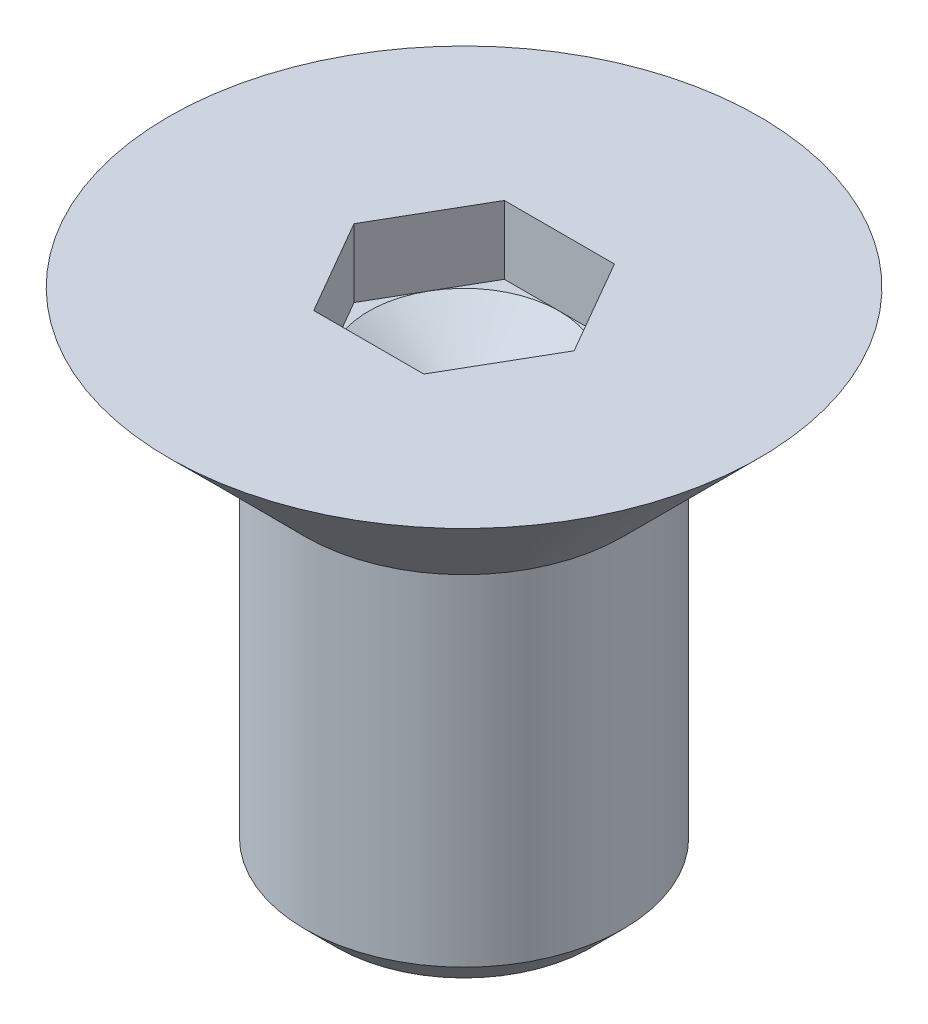
ISO-10303-21;
HEADER;
FILE_DESCRIPTION(('STEP AP214'),'2;1');
FILE_NAME('part.step','',(''),(''),'','','');
FILE_SCHEMA(('AUTOMOTIVE_DESIGN { 1 0 10303 214 1 1 1 1 }'));
ENDSEC;
DATA;
#1=APPLICATION_CONTEXT('core data for automotive mechanical design processes');
#2=APPLICATION_PROTOCOL_DEFINITION('international standard','automotive_design',2000,#1);
#3=PRODUCT_CONTEXT('',#1,'mechanical');
#4=PRODUCT('Part','Part','',(#3));
#5=PRODUCT_RELATED_PRODUCT_CATEGORY('part','',(#4));
#6=PRODUCT_DEFINITION_FORMATION('','',#4);
#7=PRODUCT_DEFINITION_CONTEXT('part definition',#1,'design');
#8=PRODUCT_DEFINITION('design','',#6,#7);
#9=PRODUCT_DEFINITION_SHAPE('','',#8);
#10=(LENGTH_UNIT() NAMED_UNIT(*) SI_UNIT(.MILLI.,.METRE.));
#11=(NAMED_UNIT(*) PLANE_ANGLE_UNIT() SI_UNIT($,.RADIAN.));
#12=(NAMED_UNIT(*) SI_UNIT($,.STERADIAN.) SOLID_ANGLE_UNIT());
#13=UNCERTAINTY_MEASURE_WITH_UNIT(LENGTH_MEASURE(1.E-05),#10,'distance_accuracy_value','');
#14=(GEOMETRIC_REPRESENTATION_CONTEXT(3) GLOBAL_UNCERTAINTY_ASSIGNED_CONTEXT((#13)) GLOBAL_UNIT_ASSIGNED_CONTEXT((#10,
#11,#12)) REPRESENTATION_CONTEXT('',''));
#15=CARTESIAN_POINT('',(0.,0.,0.));
#16=DIRECTION('',(0.,0.,1.));
#17=DIRECTION('',(1.,0.,0.));
#18=AXIS2_PLACEMENT_3D('',#15,#16,#17);
#19=CARTESIAN_POINT('',(0.,0.,0.));
#20=DIRECTION('',(0.,1.,0.));
#21=DIRECTION('',(0.,0.,1.));
#22=AXIS2_PLACEMENT_3D('',#19,#20,#21);
#23=PLANE('',#22);
#24=DIRECTION('',(-0.500000000000003,0.,0.866025403784438));
#25=VECTOR('',#24,1.);
#26=CARTESIAN_POINT('',(-0.866025403784443,0.,-1.5));
#27=LINE('',#26,#25);
#28=CARTESIAN_POINT('',(-0.866025403784443,0.,-1.5));
#29=VERTEX_POINT('',#28);
#30=CARTESIAN_POINT('',(-1.73205080756891,0.,0.));
#31=VERTEX_POINT('',#30);
#32=EDGE_CURVE('E168',#29,#31,#27,.T.);
#33=ORIENTED_EDGE('',*,*,#32,.F.);
#34=DIRECTION('',(-1.,0.,0.));
#35=VECTOR('',#34,1.);
#36=CARTESIAN_POINT('',(0.866025403784415,0.,-1.5000000000001));
#37=LINE('',#36,#35);
#38=CARTESIAN_POINT('',(0.866025403784415,0.,-1.5000000000001));
#39=VERTEX_POINT('',#38);
#40=EDGE_CURVE('E165',#39,#29,#37,.T.);
#41=ORIENTED_EDGE('',*,*,#40,.F.);
#42=DIRECTION('',(-0.500000000000004,0.,-0.866025403784438));
#43=VECTOR('',#42,1.);
#44=CARTESIAN_POINT('',(0.866025403784415,0.,-1.5000000000001));
#45=LINE('',#44,#43);
#46=CARTESIAN_POINT('',(1.73205080756886,0.,0.));
#47=VERTEX_POINT('',#46);
#48=EDGE_CURVE('E163',#47,#39,#45,.T.);
#49=ORIENTED_EDGE('',*,*,#48,.F.);
#50=DIRECTION('',(0.500000000000004,0.,-0.866025403784438));
#51=VECTOR('',#50,1.);
#52=CARTESIAN_POINT('',(0.866025403784436,0.,1.49999999999999));
#53=LINE('',#52,#51);
#54=CARTESIAN_POINT('',(0.866025403784436,0.,1.49999999999999));
#55=VERTEX_POINT('',#54);
#56=EDGE_CURVE('E161',#55,#47,#53,.T.);
#57=ORIENTED_EDGE('',*,*,#56,.F.);
#58=DIRECTION('',(1.,0.,0.));
#59=VECTOR('',#58,1.);
#60=CARTESIAN_POINT('',(0.866025403784436,0.,1.49999999999999));
#61=LINE('',#60,#59);
#62=CARTESIAN_POINT('',(-0.866025403784491,0.,1.49999999999995));
#63=VERTEX_POINT('',#62);
#64=EDGE_CURVE('E135',#63,#55,#61,.T.);
#65=ORIENTED_EDGE('',*,*,#64,.F.);
#66=DIRECTION('',(0.500000000000004,0.,0.866025403784438));
#67=VECTOR('',#66,1.);
#68=CARTESIAN_POINT('',(-0.866025403784491,0.,1.49999999999995));
#69=LINE('',#68,#67);
#70=EDGE_CURVE('E128',#31,#63,#69,.T.);
#71=ORIENTED_EDGE('',*,*,#70,.F.);
#72=EDGE_LOOP('',(#33,#41,#49,#57,#65,#71));
#73=FACE_BOUND('',#72,.T.);
#74=CARTESIAN_POINT('',(0.,0.,0.));
#75=DIRECTION('',(0.,1.,0.));
#76=DIRECTION('',(-1.,0.,0.));
#77=AXIS2_PLACEMENT_3D('',#74,#75,#76);
#78=CIRCLE('',#77,4.65);
#79=CARTESIAN_POINT('',(-4.65,0.,0.));
#80=VERTEX_POINT('',#79);
#81=EDGE_CURVE('E192',#80,#80,#78,.T.);
#82=ORIENTED_EDGE('',*,*,#81,.T.);
#83=EDGE_LOOP('',(#82));
#84=FACE_BOUND('',#83,.T.);
#85=ADVANCED_FACE('F46',(#73,#84),#23,.T.);
#86=CARTESIAN_POINT('',(0.,-8.,0.));
#87=DIRECTION('',(0.,1.,0.));
#88=DIRECTION('',(0.,0.,1.));
#89=AXIS2_PLACEMENT_3D('',#86,#87,#88);
#90=CYLINDRICAL_SURFACE('',#89,2.5);
#91=CARTESIAN_POINT('',(0.,-7.5,0.));
#92=DIRECTION('',(0.,1.,0.));
#93=DIRECTION('',(0.,0.,1.));
#94=AXIS2_PLACEMENT_3D('',#91,#92,#93);
#95=CIRCLE('',#94,2.5);
#96=CARTESIAN_POINT('',(0.,-7.5,2.5));
#97=VERTEX_POINT('',#96);
#98=EDGE_CURVE('E54',#97,#97,#95,.T.);
#99=ORIENTED_EDGE('',*,*,#98,.T.);
#100=EDGE_LOOP('',(#99));
#101=FACE_BOUND('',#100,.T.);
#102=CARTESIAN_POINT('',(0.,-2.14999999999998,0.));
#103=DIRECTION('',(0.,1.,0.));
#104=DIRECTION('',(-1.,0.,0.));
#105=AXIS2_PLACEMENT_3D('',#102,#103,#104);
#106=CIRCLE('',#105,2.5);
#107=CARTESIAN_POINT('',(-2.5,-2.14999999999998,0.));
#108=VERTEX_POINT('',#107);
#109=EDGE_CURVE('E188',#108,#108,#106,.T.);
#110=ORIENTED_EDGE('',*,*,#109,.F.);
#111=EDGE_LOOP('',(#110));
#112=FACE_BOUND('',#111,.T.);
#113=ADVANCED_FACE('F197',(#101,#112),#90,.T.);
#114=CARTESIAN_POINT('',(0.,-8.,0.));
#115=DIRECTION('',(0.,1.,0.));
#116=DIRECTION('',(0.,0.,1.));
#117=AXIS2_PLACEMENT_3D('',#114,#115,#116);
#118=PLANE('',#117);
#119=CARTESIAN_POINT('',(0.,-8.,0.));
#120=DIRECTION('',(0.,1.,0.));
#121=DIRECTION('',(0.,0.,1.));
#122=AXIS2_PLACEMENT_3D('',#119,#120,#121);
#123=CIRCLE('',#122,2.);
#124=CARTESIAN_POINT('',(0.,-8.,2.));
#125=VERTEX_POINT('',#124);
#126=EDGE_CURVE('E13',#125,#125,#123,.F.);
#127=ORIENTED_EDGE('',*,*,#126,.T.);
#128=EDGE_LOOP('',(#127));
#129=FACE_BOUND('',#128,.T.);
#130=ADVANCED_FACE('F202',(#129),#118,.F.);
#131=CARTESIAN_POINT('',(0.,-7.5,0.));
#132=DIRECTION('',(0.,1.,0.));
#133=DIRECTION('',(0.,0.,1.));
#134=AXIS2_PLACEMENT_3D('',#131,#132,#133);
#135=CONICAL_SURFACE('',#134,2.5,0.78539816339745);
#136=ORIENTED_EDGE('',*,*,#126,.F.);
#137=EDGE_LOOP('',(#136));
#138=FACE_BOUND('',#137,.T.);
#139=ORIENTED_EDGE('',*,*,#98,.F.);
#140=EDGE_LOOP('',(#139));
#141=FACE_BOUND('',#140,.T.);
#142=ADVANCED_FACE('F48',(#138,#141),#135,.T.);
#143=CARTESIAN_POINT('',(0.,-2.14999999999998,0.));
#144=DIRECTION('',(0.,1.,0.));
#145=DIRECTION('',(-1.,0.,0.));
#146=AXIS2_PLACEMENT_3D('',#143,#144,#145);
#147=CONICAL_SURFACE('',#146,2.5,0.785398163397454);
#148=ORIENTED_EDGE('',*,*,#81,.F.);
#149=EDGE_LOOP('',(#148));
#150=FACE_BOUND('',#149,.T.);
#151=ORIENTED_EDGE('',*,*,#109,.T.);
#152=EDGE_LOOP('',(#151));
#153=FACE_BOUND('',#152,.T.);
#154=ADVANCED_FACE('F201',(#150,#153),#147,.T.);
#155=CARTESIAN_POINT('',(0.866025403784436,-1.075,1.49999999999999));
#156=DIRECTION('',(0.,0.,1.));
#157=DIRECTION('',(1.,0.,0.));
#158=AXIS2_PLACEMENT_3D('',#155,#156,#157);
#159=PLANE('',#158);
#160=DIRECTION('',(1.,0.,0.));
#161=VECTOR('',#160,1.);
#162=CARTESIAN_POINT('',(0.866025403784436,-1.075,1.49999999999999));
#163=LINE('',#162,#161);
#164=CARTESIAN_POINT('',(-0.866025403784491,-1.075,1.49999999999995));
#165=VERTEX_POINT('',#164);
#166=CARTESIAN_POINT('',(0.,-1.075,1.49999999999997));
#167=VERTEX_POINT('',#166);
#168=EDGE_CURVE('E127',#165,#167,#163,.T.);
#169=ORIENTED_EDGE('',*,*,#168,.F.);
#170=DIRECTION('',(0.,1.,0.));
#171=VECTOR('',#170,1.);
#172=CARTESIAN_POINT('',(-0.866025403784491,-1.075,1.49999999999995));
#173=LINE('',#172,#171);
#174=EDGE_CURVE('E173',#165,#63,#173,.T.);
#175=ORIENTED_EDGE('',*,*,#174,.T.);
#176=ORIENTED_EDGE('',*,*,#64,.T.);
#177=DIRECTION('',(0.,1.,0.));
#178=VECTOR('',#177,1.);
#179=CARTESIAN_POINT('',(0.866025403784436,-1.075,1.49999999999999));
#180=LINE('',#179,#178);
#181=CARTESIAN_POINT('',(0.866025403784436,-1.075,1.49999999999999));
#182=VERTEX_POINT('',#181);
#183=EDGE_CURVE('E132',#182,#55,#180,.T.);
#184=ORIENTED_EDGE('',*,*,#183,.F.);
#185=EDGE_CURVE('E117',#167,#182,#163,.T.);
#186=ORIENTED_EDGE('',*,*,#185,.F.);
#187=EDGE_LOOP('',(#169,#175,#176,#184,#186));
#188=FACE_BOUND('',#187,.T.);
#189=ADVANCED_FACE('F133',(#188),#159,.F.);
#190=CARTESIAN_POINT('',(-0.866025403784491,-1.075,1.49999999999995));
#191=DIRECTION('',(-0.866025403784438,0.,0.500000000000004));
#192=DIRECTION('',(0.500000000000004,0.,0.866025403784438));
#193=AXIS2_PLACEMENT_3D('',#190,#191,#192);
#194=PLANE('',#193);
#195=DIRECTION('',(0.500000000000004,0.,0.866025403784438));
#196=VECTOR('',#195,1.);
#197=CARTESIAN_POINT('',(-0.866025403784491,-1.075,1.49999999999995));
#198=LINE('',#197,#196);
#199=CARTESIAN_POINT('',(-1.73205080756891,-1.075,0.));
#200=VERTEX_POINT('',#199);
#201=CARTESIAN_POINT('',(-1.29903810567666,-1.075,0.750000000000001));
#202=VERTEX_POINT('',#201);
#203=EDGE_CURVE('E139',#200,#202,#198,.T.);
#204=ORIENTED_EDGE('',*,*,#203,.F.);
#205=DIRECTION('',(0.,1.,0.));
#206=VECTOR('',#205,1.);
#207=CARTESIAN_POINT('',(-1.73205080756891,-1.075,0.));
#208=LINE('',#207,#206);
#209=EDGE_CURVE('E176',#200,#31,#208,.T.);
#210=ORIENTED_EDGE('',*,*,#209,.T.);
#211=ORIENTED_EDGE('',*,*,#70,.T.);
#212=ORIENTED_EDGE('',*,*,#174,.F.);
#213=EDGE_CURVE('E157',#202,#165,#198,.T.);
#214=ORIENTED_EDGE('',*,*,#213,.F.);
#215=EDGE_LOOP('',(#204,#210,#211,#212,#214));
#216=FACE_BOUND('',#215,.T.);
#217=ADVANCED_FACE('F228',(#216),#194,.F.);
#218=CARTESIAN_POINT('',(-0.866025403784443,-1.075,-1.5));
#219=DIRECTION('',(-0.866025403784438,0.,-0.500000000000003));
#220=DIRECTION('',(-0.500000000000003,0.,0.866025403784438));
#221=AXIS2_PLACEMENT_3D('',#218,#219,#220);
#222=PLANE('',#221);
#223=DIRECTION('',(-0.500000000000003,0.,0.866025403784438));
#224=VECTOR('',#223,1.);
#225=CARTESIAN_POINT('',(-0.866025403784443,-1.075,-1.5));
#226=LINE('',#225,#224);
#227=CARTESIAN_POINT('',(-0.866025403784443,-1.075,-1.5));
#228=VERTEX_POINT('',#227);
#229=CARTESIAN_POINT('',(-1.29903810567666,-1.075,-0.750000000000028));
#230=VERTEX_POINT('',#229);
#231=EDGE_CURVE('E61',#228,#230,#226,.T.);
#232=ORIENTED_EDGE('',*,*,#231,.F.);
#233=DIRECTION('',(0.,1.,0.));
#234=VECTOR('',#233,1.);
#235=CARTESIAN_POINT('',(-0.866025403784443,-1.075,-1.5));
#236=LINE('',#235,#234);
#237=EDGE_CURVE('E179',#228,#29,#236,.T.);
#238=ORIENTED_EDGE('',*,*,#237,.T.);
#239=ORIENTED_EDGE('',*,*,#32,.T.);
#240=ORIENTED_EDGE('',*,*,#209,.F.);
#241=EDGE_CURVE('E155',#230,#200,#226,.T.);
#242=ORIENTED_EDGE('',*,*,#241,.F.);
#243=EDGE_LOOP('',(#232,#238,#239,#240,#242));
#244=FACE_BOUND('',#243,.T.);
#245=ADVANCED_FACE('F239',(#244),#222,.F.);
#246=CARTESIAN_POINT('',(0.866025403784415,-1.075,-1.5000000000001));
#247=DIRECTION('',(0.,0.,-1.));
#248=DIRECTION('',(-1.,0.,0.));
#249=AXIS2_PLACEMENT_3D('',#246,#247,#248);
#250=PLANE('',#249);
#251=DIRECTION('',(-1.,0.,0.));
#252=VECTOR('',#251,1.);
#253=CARTESIAN_POINT('',(0.866025403784415,-1.075,-1.5000000000001));
#254=LINE('',#253,#252);
#255=CARTESIAN_POINT('',(0.866025403784415,-1.075,-1.5000000000001));
#256=VERTEX_POINT('',#255);
#257=CARTESIAN_POINT('',(0.,-1.075,-1.50000000000008));
#258=VERTEX_POINT('',#257);
#259=EDGE_CURVE('E152',#256,#258,#254,.T.);
#260=ORIENTED_EDGE('',*,*,#259,.F.);
#261=DIRECTION('',(0.,1.,0.));
#262=VECTOR('',#261,1.);
#263=CARTESIAN_POINT('',(0.866025403784415,-1.075,-1.5000000000001));
#264=LINE('',#263,#262);
#265=EDGE_CURVE('E182',#256,#39,#264,.T.);
#266=ORIENTED_EDGE('',*,*,#265,.T.);
#267=ORIENTED_EDGE('',*,*,#40,.T.);
#268=ORIENTED_EDGE('',*,*,#237,.F.);
#269=EDGE_CURVE('E151',#258,#228,#254,.T.);
#270=ORIENTED_EDGE('',*,*,#269,.F.);
#271=EDGE_LOOP('',(#260,#266,#267,#268,#270));
#272=FACE_BOUND('',#271,.T.);
#273=ADVANCED_FACE('F235',(#272),#250,.F.);
#274=CARTESIAN_POINT('',(0.866025403784415,-1.075,-1.5000000000001));
#275=DIRECTION('',(0.866025403784438,0.,-0.500000000000004));
#276=DIRECTION('',(-0.500000000000004,0.,-0.866025403784438));
#277=AXIS2_PLACEMENT_3D('',#274,#275,#276);
#278=PLANE('',#277);
#279=DIRECTION('',(-0.500000000000004,0.,-0.866025403784438));
#280=VECTOR('',#279,1.);
#281=CARTESIAN_POINT('',(0.866025403784415,-1.075,-1.5000000000001));
#282=LINE('',#281,#280);
#283=CARTESIAN_POINT('',(1.73205080756886,-1.075,0.));
#284=VERTEX_POINT('',#283);
#285=CARTESIAN_POINT('',(1.29903810567663,-1.075,-0.750000000000084));
#286=VERTEX_POINT('',#285);
#287=EDGE_CURVE('E147',#284,#286,#282,.T.);
#288=ORIENTED_EDGE('',*,*,#287,.F.);
#289=DIRECTION('',(0.,1.,0.));
#290=VECTOR('',#289,1.);
#291=CARTESIAN_POINT('',(1.73205080756886,-1.075,0.));
#292=LINE('',#291,#290);
#293=EDGE_CURVE('E138',#284,#47,#292,.T.);
#294=ORIENTED_EDGE('',*,*,#293,.T.);
#295=ORIENTED_EDGE('',*,*,#48,.T.);
#296=ORIENTED_EDGE('',*,*,#265,.F.);
#297=EDGE_CURVE('E145',#286,#256,#282,.T.);
#298=ORIENTED_EDGE('',*,*,#297,.F.);
#299=EDGE_LOOP('',(#288,#294,#295,#296,#298));
#300=FACE_BOUND('',#299,.T.);
#301=ADVANCED_FACE('F232',(#300),#278,.F.);
#302=CARTESIAN_POINT('',(0.866025403784436,-1.075,1.49999999999999));
#303=DIRECTION('',(0.866025403784438,0.,0.500000000000004));
#304=DIRECTION('',(0.500000000000004,0.,-0.866025403784438));
#305=AXIS2_PLACEMENT_3D('',#302,#303,#304);
#306=PLANE('',#305);
#307=DIRECTION('',(0.500000000000004,0.,-0.866025403784438));
#308=VECTOR('',#307,1.);
#309=CARTESIAN_POINT('',(0.866025403784436,-1.075,1.49999999999999));
#310=LINE('',#309,#308);
#311=CARTESIAN_POINT('',(1.29903810567666,-1.075,0.749999999999973));
#312=VERTEX_POINT('',#311);
#313=EDGE_CURVE('E121',#182,#312,#310,.T.);
#314=ORIENTED_EDGE('',*,*,#313,.F.);
#315=ORIENTED_EDGE('',*,*,#183,.T.);
#316=ORIENTED_EDGE('',*,*,#56,.T.);
#317=ORIENTED_EDGE('',*,*,#293,.F.);
#318=EDGE_CURVE('E144',#312,#284,#310,.T.);
#319=ORIENTED_EDGE('',*,*,#318,.F.);
#320=EDGE_LOOP('',(#314,#315,#316,#317,#319));
#321=FACE_BOUND('',#320,.T.);
#322=ADVANCED_FACE('F142',(#321),#306,.F.);
#323=CARTESIAN_POINT('',(-0.866025403784491,-1.075,1.49999999999995));
#324=DIRECTION('',(0.,-1.,0.));
#325=DIRECTION('',(0.,0.,-1.));
#326=AXIS2_PLACEMENT_3D('',#323,#324,#325);
#327=PLANE('',#326);
#328=CARTESIAN_POINT('',(0.,-1.075,0.));
#329=DIRECTION('',(0.,1.,0.));
#330=DIRECTION('',(0.,0.,1.));
#331=AXIS2_PLACEMENT_3D('',#328,#329,#330);
#332=CIRCLE('',#331,1.5);
#333=EDGE_CURVE('E262',#286,#258,#332,.T.);
#334=ORIENTED_EDGE('',*,*,#333,.F.);
#335=ORIENTED_EDGE('',*,*,#297,.T.);
#336=ORIENTED_EDGE('',*,*,#259,.T.);
#337=EDGE_LOOP('',(#334,#335,#336));
#338=FACE_BOUND('',#337,.T.);
#339=ADVANCED_FACE('F231',(#338),#327,.F.);
#340=EDGE_CURVE('E189',#312,#286,#332,.T.);
#341=ORIENTED_EDGE('',*,*,#340,.F.);
#342=ORIENTED_EDGE('',*,*,#318,.T.);
#343=ORIENTED_EDGE('',*,*,#287,.T.);
#344=EDGE_LOOP('',(#341,#342,#343));
#345=FACE_BOUND('',#344,.T.);
#346=ADVANCED_FACE('F255',(#345),#327,.F.);
#347=EDGE_CURVE('E123',#167,#312,#332,.T.);
#348=ORIENTED_EDGE('',*,*,#347,.F.);
#349=ORIENTED_EDGE('',*,*,#185,.T.);
#350=ORIENTED_EDGE('',*,*,#313,.T.);
#351=EDGE_LOOP('',(#348,#349,#350));
#352=FACE_BOUND('',#351,.T.);
#353=ADVANCED_FACE('F119',(#352),#327,.F.);
#354=EDGE_CURVE('E175',#202,#167,#332,.T.);
#355=ORIENTED_EDGE('',*,*,#354,.F.);
#356=ORIENTED_EDGE('',*,*,#213,.T.);
#357=ORIENTED_EDGE('',*,*,#168,.T.);
#358=EDGE_LOOP('',(#355,#356,#357));
#359=FACE_BOUND('',#358,.T.);
#360=ADVANCED_FACE('F252',(#359),#327,.F.);
#361=EDGE_CURVE('E273',#230,#202,#332,.T.);
#362=ORIENTED_EDGE('',*,*,#361,.F.);
#363=ORIENTED_EDGE('',*,*,#241,.T.);
#364=ORIENTED_EDGE('',*,*,#203,.T.);
#365=EDGE_LOOP('',(#362,#363,#364));
#366=FACE_BOUND('',#365,.T.);
#367=ADVANCED_FACE('F248',(#366),#327,.F.);
#368=EDGE_CURVE('E268',#258,#230,#332,.T.);
#369=ORIENTED_EDGE('',*,*,#368,.F.);
#370=ORIENTED_EDGE('',*,*,#269,.T.);
#371=ORIENTED_EDGE('',*,*,#231,.T.);
#372=EDGE_LOOP('',(#369,#370,#371));
#373=FACE_BOUND('',#372,.T.);
#374=ADVANCED_FACE('F224',(#373),#327,.F.);
#375=CARTESIAN_POINT('',(0.,-1.94102540378443,0.));
#376=DIRECTION('',(0.,1.,0.));
#377=DIRECTION('',(0.,0.,1.));
#378=AXIS2_PLACEMENT_3D('',#375,#376,#377);
#379=CONICAL_SURFACE('',#378,0.,1.0471975511966);
#380=ORIENTED_EDGE('',*,*,#347,.T.);
#381=ORIENTED_EDGE('',*,*,#340,.T.);
#382=ORIENTED_EDGE('',*,*,#333,.T.);
#383=ORIENTED_EDGE('',*,*,#368,.T.);
#384=ORIENTED_EDGE('',*,*,#361,.T.);
#385=ORIENTED_EDGE('',*,*,#354,.T.);
#386=EDGE_LOOP('',(#380,#381,#382,#383,#384,#385));
#387=FACE_BOUND('',#386,.T.);
#388=CARTESIAN_POINT('',(0.,-1.94102540378443,0.));
#389=VERTEX_POINT('',#388);
#390=VERTEX_LOOP('',#389);
#391=FACE_BOUND('',#390,.T.);
#392=ADVANCED_FACE('F221',(#387,#391),#379,.F.);
#393=CLOSED_SHELL('',(#85,#113,#130,#142,#154,#189,#217,#245,#273,#301,#322,#339,#346,#353,#360,
#367,#374,#392));
#394=MANIFOLD_SOLID_BREP('B2',#393);
#395=ADVANCED_BREP_SHAPE_REPRESENTATION('',(#18,#394),#14);
#396=SHAPE_DEFINITION_REPRESENTATION(#9,#395);
ENDSEC;
END-ISO-10303-21;
